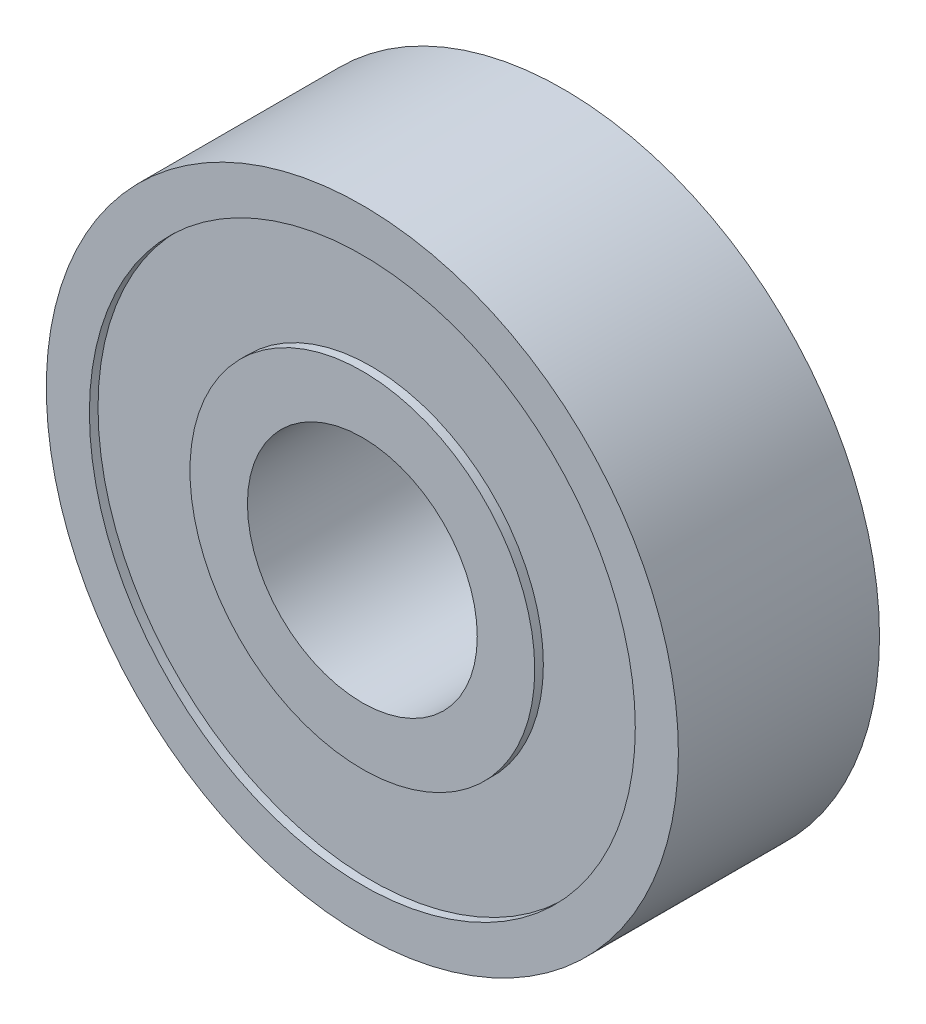
ISO-10303-21;
HEADER;
FILE_DESCRIPTION(('STEP AP214'),'2;1');
FILE_NAME('part.step','',(''),(''),'','','');
FILE_SCHEMA(('AUTOMOTIVE_DESIGN { 1 0 10303 214 1 1 1 1 }'));
ENDSEC;
DATA;
#1=APPLICATION_CONTEXT('core data for automotive mechanical design processes');
#2=APPLICATION_PROTOCOL_DEFINITION('international standard','automotive_design',2000,#1);
#3=PRODUCT_CONTEXT('',#1,'mechanical');
#4=PRODUCT('Part','Part','',(#3));
#5=PRODUCT_RELATED_PRODUCT_CATEGORY('part','',(#4));
#6=PRODUCT_DEFINITION_FORMATION('','',#4);
#7=PRODUCT_DEFINITION_CONTEXT('part definition',#1,'design');
#8=PRODUCT_DEFINITION('design','',#6,#7);
#9=PRODUCT_DEFINITION_SHAPE('','',#8);
#10=(LENGTH_UNIT() NAMED_UNIT(*) SI_UNIT(.MILLI.,.METRE.));
#11=(NAMED_UNIT(*) PLANE_ANGLE_UNIT() SI_UNIT($,.RADIAN.));
#12=(NAMED_UNIT(*) SI_UNIT($,.STERADIAN.) SOLID_ANGLE_UNIT());
#13=UNCERTAINTY_MEASURE_WITH_UNIT(LENGTH_MEASURE(1.E-05),#10,'distance_accuracy_value','');
#14=(GEOMETRIC_REPRESENTATION_CONTEXT(3) GLOBAL_UNCERTAINTY_ASSIGNED_CONTEXT((#13)) GLOBAL_UNIT_ASSIGNED_CONTEXT((#10,
#11,#12)) REPRESENTATION_CONTEXT('',''));
#15=CARTESIAN_POINT('',(0.,0.,0.));
#16=DIRECTION('',(0.,0.,1.));
#17=DIRECTION('',(1.,0.,0.));
#18=AXIS2_PLACEMENT_3D('',#15,#16,#17);
#19=CARTESIAN_POINT('',(0.,0.,7.));
#20=DIRECTION('',(0.,0.,-1.));
#21=DIRECTION('',(-1.,0.,0.));
#22=AXIS2_PLACEMENT_3D('',#19,#20,#21);
#23=CYLINDRICAL_SURFACE('',#22,9.5);
#24=CARTESIAN_POINT('',(0.,0.,0.));
#25=DIRECTION('',(0.,0.,1.));
#26=DIRECTION('',(1.,0.,0.));
#27=AXIS2_PLACEMENT_3D('',#24,#25,#26);
#28=CIRCLE('',#27,9.5);
#29=CARTESIAN_POINT('',(9.5,0.,0.));
#30=VERTEX_POINT('',#29);
#31=EDGE_CURVE('E55',#30,#30,#28,.T.);
#32=ORIENTED_EDGE('',*,*,#31,.F.);
#33=EDGE_LOOP('',(#32));
#34=FACE_BOUND('',#33,.T.);
#35=CARTESIAN_POINT('',(0.,0.,0.3));
#36=DIRECTION('',(0.,0.,1.));
#37=DIRECTION('',(1.,0.,0.));
#38=AXIS2_PLACEMENT_3D('',#35,#36,#37);
#39=CIRCLE('',#38,9.5);
#40=CARTESIAN_POINT('',(9.5,0.,0.3));
#41=VERTEX_POINT('',#40);
#42=EDGE_CURVE('E58',#41,#41,#39,.T.);
#43=ORIENTED_EDGE('',*,*,#42,.T.);
#44=EDGE_LOOP('',(#43));
#45=FACE_BOUND('',#44,.T.);
#46=ADVANCED_FACE('F37',(#34,#45),#23,.F.);
#47=CARTESIAN_POINT('',(0.,0.,7.));
#48=DIRECTION('',(0.,0.,1.));
#49=DIRECTION('',(1.,0.,0.));
#50=AXIS2_PLACEMENT_3D('',#47,#48,#49);
#51=PLANE('',#50);
#52=CARTESIAN_POINT('',(0.,0.,7.));
#53=DIRECTION('',(0.,0.,1.));
#54=DIRECTION('',(1.,0.,0.));
#55=AXIS2_PLACEMENT_3D('',#52,#53,#54);
#56=CIRCLE('',#55,11.);
#57=CARTESIAN_POINT('',(11.,0.,7.));
#58=VERTEX_POINT('',#57);
#59=EDGE_CURVE('E44',#58,#58,#56,.T.);
#60=ORIENTED_EDGE('',*,*,#59,.T.);
#61=EDGE_LOOP('',(#60));
#62=FACE_BOUND('',#61,.T.);
#63=CARTESIAN_POINT('',(0.,0.,7.));
#64=DIRECTION('',(0.,0.,1.));
#65=DIRECTION('',(1.,0.,0.));
#66=AXIS2_PLACEMENT_3D('',#63,#64,#65);
#67=CIRCLE('',#66,9.5);
#68=CARTESIAN_POINT('',(9.5,0.,7.));
#69=VERTEX_POINT('',#68);
#70=EDGE_CURVE('E53',#69,#69,#67,.T.);
#71=ORIENTED_EDGE('',*,*,#70,.F.);
#72=EDGE_LOOP('',(#71));
#73=FACE_BOUND('',#72,.T.);
#74=ADVANCED_FACE('F103',(#62,#73),#51,.T.);
#75=CARTESIAN_POINT('',(0.,0.,0.));
#76=DIRECTION('',(0.,0.,1.));
#77=DIRECTION('',(1.,0.,0.));
#78=AXIS2_PLACEMENT_3D('',#75,#76,#77);
#79=PLANE('',#78);
#80=CARTESIAN_POINT('',(0.,0.,0.));
#81=DIRECTION('',(0.,0.,1.));
#82=DIRECTION('',(1.,0.,0.));
#83=AXIS2_PLACEMENT_3D('',#80,#81,#82);
#84=CIRCLE('',#83,11.);
#85=CARTESIAN_POINT('',(11.,0.,0.));
#86=VERTEX_POINT('',#85);
#87=EDGE_CURVE('E48',#86,#86,#84,.T.);
#88=ORIENTED_EDGE('',*,*,#87,.F.);
#89=EDGE_LOOP('',(#88));
#90=FACE_BOUND('',#89,.T.);
#91=ORIENTED_EDGE('',*,*,#31,.T.);
#92=EDGE_LOOP('',(#91));
#93=FACE_BOUND('',#92,.T.);
#94=ADVANCED_FACE('F112',(#90,#93),#79,.F.);
#95=CARTESIAN_POINT('',(0.,0.,7.));
#96=DIRECTION('',(0.,0.,-1.));
#97=DIRECTION('',(-1.,0.,0.));
#98=AXIS2_PLACEMENT_3D('',#95,#96,#97);
#99=CYLINDRICAL_SURFACE('',#98,11.);
#100=ORIENTED_EDGE('',*,*,#59,.F.);
#101=EDGE_LOOP('',(#100));
#102=FACE_BOUND('',#101,.T.);
#103=ORIENTED_EDGE('',*,*,#87,.T.);
#104=EDGE_LOOP('',(#103));
#105=FACE_BOUND('',#104,.T.);
#106=ADVANCED_FACE('F39',(#102,#105),#99,.T.);
#107=CARTESIAN_POINT('',(0.,0.,6.7));
#108=DIRECTION('',(0.,0.,1.));
#109=DIRECTION('',(1.,0.,0.));
#110=AXIS2_PLACEMENT_3D('',#107,#108,#109);
#111=CIRCLE('',#110,9.5);
#112=CARTESIAN_POINT('',(9.5,0.,6.7));
#113=VERTEX_POINT('',#112);
#114=EDGE_CURVE('E10',#113,#113,#111,.T.);
#115=ORIENTED_EDGE('',*,*,#114,.F.);
#116=EDGE_LOOP('',(#115));
#117=FACE_BOUND('',#116,.T.);
#118=ORIENTED_EDGE('',*,*,#70,.T.);
#119=EDGE_LOOP('',(#118));
#120=FACE_BOUND('',#119,.T.);
#121=ADVANCED_FACE('F106',(#117,#120),#23,.F.);
#122=CARTESIAN_POINT('',(0.,0.,6.7));
#123=DIRECTION('',(0.,0.,1.));
#124=DIRECTION('',(1.,0.,0.));
#125=AXIS2_PLACEMENT_3D('',#122,#123,#124);
#126=PLANE('',#125);
#127=ORIENTED_EDGE('',*,*,#114,.T.);
#128=EDGE_LOOP('',(#127));
#129=FACE_BOUND('',#128,.T.);
#130=CARTESIAN_POINT('',(0.,0.,6.7));
#131=DIRECTION('',(0.,0.,1.));
#132=DIRECTION('',(1.,0.,0.));
#133=AXIS2_PLACEMENT_3D('',#130,#131,#132);
#134=CIRCLE('',#133,6.);
#135=CARTESIAN_POINT('',(6.,0.,6.7));
#136=VERTEX_POINT('',#135);
#137=EDGE_CURVE('E63',#136,#136,#134,.T.);
#138=ORIENTED_EDGE('',*,*,#137,.F.);
#139=EDGE_LOOP('',(#138));
#140=FACE_BOUND('',#139,.T.);
#141=ADVANCED_FACE('F117',(#129,#140),#126,.T.);
#142=CARTESIAN_POINT('',(0.,0.,0.3));
#143=DIRECTION('',(0.,0.,1.));
#144=DIRECTION('',(1.,0.,0.));
#145=AXIS2_PLACEMENT_3D('',#142,#143,#144);
#146=PLANE('',#145);
#147=ORIENTED_EDGE('',*,*,#42,.F.);
#148=EDGE_LOOP('',(#147));
#149=FACE_BOUND('',#148,.T.);
#150=CARTESIAN_POINT('',(0.,0.,0.3));
#151=DIRECTION('',(0.,0.,1.));
#152=DIRECTION('',(1.,0.,0.));
#153=AXIS2_PLACEMENT_3D('',#150,#151,#152);
#154=CIRCLE('',#153,6.);
#155=CARTESIAN_POINT('',(6.,0.,0.3));
#156=VERTEX_POINT('',#155);
#157=EDGE_CURVE('E66',#156,#156,#154,.F.);
#158=ORIENTED_EDGE('',*,*,#157,.F.);
#159=EDGE_LOOP('',(#158));
#160=FACE_BOUND('',#159,.T.);
#161=ADVANCED_FACE('F98',(#149,#160),#146,.F.);
#162=CARTESIAN_POINT('',(0.,0.,7.));
#163=DIRECTION('',(0.,0.,-1.));
#164=DIRECTION('',(-1.,0.,0.));
#165=AXIS2_PLACEMENT_3D('',#162,#163,#164);
#166=CYLINDRICAL_SURFACE('',#165,6.);
#167=CARTESIAN_POINT('',(0.,0.,0.));
#168=DIRECTION('',(0.,0.,1.));
#169=DIRECTION('',(1.,0.,0.));
#170=AXIS2_PLACEMENT_3D('',#167,#168,#169);
#171=CIRCLE('',#170,6.);
#172=CARTESIAN_POINT('',(6.,0.,0.));
#173=VERTEX_POINT('',#172);
#174=EDGE_CURVE('E70',#173,#173,#171,.T.);
#175=ORIENTED_EDGE('',*,*,#174,.T.);
#176=EDGE_LOOP('',(#175));
#177=FACE_BOUND('',#176,.T.);
#178=ORIENTED_EDGE('',*,*,#157,.T.);
#179=EDGE_LOOP('',(#178));
#180=FACE_BOUND('',#179,.T.);
#181=ADVANCED_FACE('F88',(#177,#180),#166,.T.);
#182=CARTESIAN_POINT('',(0.,0.,7.));
#183=DIRECTION('',(0.,0.,1.));
#184=DIRECTION('',(1.,0.,0.));
#185=AXIS2_PLACEMENT_3D('',#182,#183,#184);
#186=PLANE('',#185);
#187=CARTESIAN_POINT('',(0.,0.,7.));
#188=DIRECTION('',(0.,0.,1.));
#189=DIRECTION('',(1.,0.,0.));
#190=AXIS2_PLACEMENT_3D('',#187,#188,#189);
#191=CIRCLE('',#190,6.);
#192=CARTESIAN_POINT('',(6.,0.,7.));
#193=VERTEX_POINT('',#192);
#194=EDGE_CURVE('E69',#193,#193,#191,.T.);
#195=ORIENTED_EDGE('',*,*,#194,.T.);
#196=EDGE_LOOP('',(#195));
#197=FACE_BOUND('',#196,.T.);
#198=CARTESIAN_POINT('',(0.,0.,7.));
#199=DIRECTION('',(0.,0.,1.));
#200=DIRECTION('',(1.,0.,0.));
#201=AXIS2_PLACEMENT_3D('',#198,#199,#200);
#202=CIRCLE('',#201,4.);
#203=CARTESIAN_POINT('',(4.,0.,7.));
#204=VERTEX_POINT('',#203);
#205=EDGE_CURVE('E73',#204,#204,#202,.T.);
#206=ORIENTED_EDGE('',*,*,#205,.F.);
#207=EDGE_LOOP('',(#206));
#208=FACE_BOUND('',#207,.T.);
#209=ADVANCED_FACE('F85',(#197,#208),#186,.T.);
#210=CARTESIAN_POINT('',(0.,0.,0.));
#211=DIRECTION('',(0.,0.,1.));
#212=DIRECTION('',(1.,0.,0.));
#213=AXIS2_PLACEMENT_3D('',#210,#211,#212);
#214=PLANE('',#213);
#215=ORIENTED_EDGE('',*,*,#174,.F.);
#216=EDGE_LOOP('',(#215));
#217=FACE_BOUND('',#216,.T.);
#218=CARTESIAN_POINT('',(0.,0.,0.));
#219=DIRECTION('',(0.,0.,1.));
#220=DIRECTION('',(1.,0.,0.));
#221=AXIS2_PLACEMENT_3D('',#218,#219,#220);
#222=CIRCLE('',#221,4.);
#223=CARTESIAN_POINT('',(4.,0.,0.));
#224=VERTEX_POINT('',#223);
#225=EDGE_CURVE('E76',#224,#224,#222,.T.);
#226=ORIENTED_EDGE('',*,*,#225,.T.);
#227=EDGE_LOOP('',(#226));
#228=FACE_BOUND('',#227,.T.);
#229=ADVANCED_FACE('F87',(#217,#228),#214,.F.);
#230=ORIENTED_EDGE('',*,*,#137,.T.);
#231=EDGE_LOOP('',(#230));
#232=FACE_BOUND('',#231,.T.);
#233=ORIENTED_EDGE('',*,*,#194,.F.);
#234=EDGE_LOOP('',(#233));
#235=FACE_BOUND('',#234,.T.);
#236=ADVANCED_FACE('F95',(#232,#235),#166,.T.);
#237=CARTESIAN_POINT('',(0.,0.,7.));
#238=DIRECTION('',(0.,0.,-1.));
#239=DIRECTION('',(-1.,0.,0.));
#240=AXIS2_PLACEMENT_3D('',#237,#238,#239);
#241=CYLINDRICAL_SURFACE('',#240,4.);
#242=ORIENTED_EDGE('',*,*,#205,.T.);
#243=EDGE_LOOP('',(#242));
#244=FACE_BOUND('',#243,.T.);
#245=ORIENTED_EDGE('',*,*,#225,.F.);
#246=EDGE_LOOP('',(#245));
#247=FACE_BOUND('',#246,.T.);
#248=ADVANCED_FACE('F82',(#244,#247),#241,.F.);
#249=CLOSED_SHELL('',(#46,#74,#94,#106,#121,#141,#161,#181,#209,#229,#236,#248));
#250=MANIFOLD_SOLID_BREP('B2',#249);
#251=ADVANCED_BREP_SHAPE_REPRESENTATION('',(#18,#250),#14);
#252=SHAPE_DEFINITION_REPRESENTATION(#9,#251);
ENDSEC;
END-ISO-10303-21;
